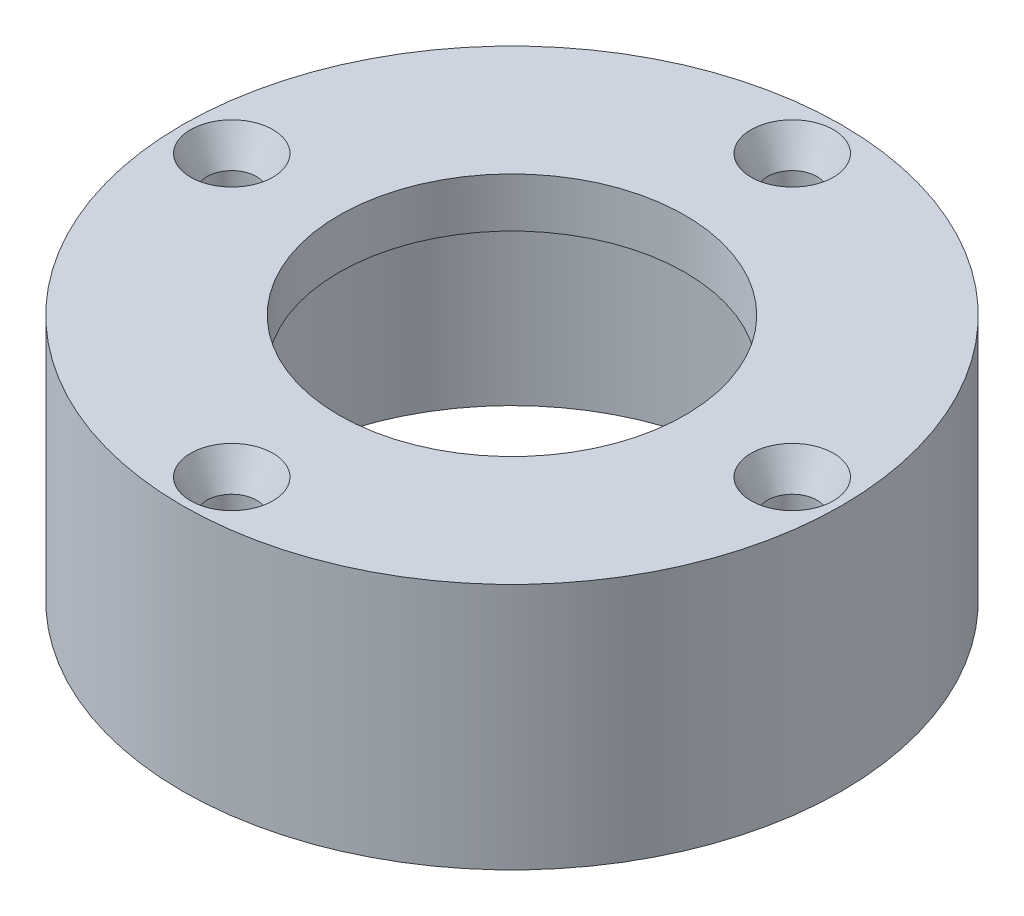
ISO-10303-21;
HEADER;
FILE_DESCRIPTION(('STEP AP214'),'2;1');
FILE_NAME('part.step','',(''),(''),'','','');
FILE_SCHEMA(('AUTOMOTIVE_DESIGN { 1 0 10303 214 1 1 1 1 }'));
ENDSEC;
DATA;
#1=APPLICATION_CONTEXT('core data for automotive mechanical design processes');
#2=APPLICATION_PROTOCOL_DEFINITION('international standard','automotive_design',2000,#1);
#3=PRODUCT_CONTEXT('',#1,'mechanical');
#4=PRODUCT('Part','Part','',(#3));
#5=PRODUCT_RELATED_PRODUCT_CATEGORY('part','',(#4));
#6=PRODUCT_DEFINITION_FORMATION('','',#4);
#7=PRODUCT_DEFINITION_CONTEXT('part definition',#1,'design');
#8=PRODUCT_DEFINITION('design','',#6,#7);
#9=PRODUCT_DEFINITION_SHAPE('','',#8);
#10=(LENGTH_UNIT() NAMED_UNIT(*) SI_UNIT(.MILLI.,.METRE.));
#11=(NAMED_UNIT(*) PLANE_ANGLE_UNIT() SI_UNIT($,.RADIAN.));
#12=(NAMED_UNIT(*) SI_UNIT($,.STERADIAN.) SOLID_ANGLE_UNIT());
#13=UNCERTAINTY_MEASURE_WITH_UNIT(LENGTH_MEASURE(1.E-05),#10,'distance_accuracy_value','');
#14=(GEOMETRIC_REPRESENTATION_CONTEXT(3) GLOBAL_UNCERTAINTY_ASSIGNED_CONTEXT((#13)) GLOBAL_UNIT_ASSIGNED_CONTEXT((#10,
#11,#12)) REPRESENTATION_CONTEXT('',''));
#15=CARTESIAN_POINT('',(0.,0.,0.));
#16=DIRECTION('',(0.,0.,1.));
#17=DIRECTION('',(1.,0.,0.));
#18=AXIS2_PLACEMENT_3D('',#15,#16,#17);
#19=CARTESIAN_POINT('',(0.,15.,0.));
#20=DIRECTION('',(0.,-1.,0.));
#21=DIRECTION('',(0.,0.,-1.));
#22=AXIS2_PLACEMENT_3D('',#19,#20,#21);
#23=CYLINDRICAL_SURFACE('',#22,20.);
#24=CARTESIAN_POINT('',(0.,15.,0.));
#25=DIRECTION('',(0.,1.,0.));
#26=DIRECTION('',(0.,0.,1.));
#27=AXIS2_PLACEMENT_3D('',#24,#25,#26);
#28=CIRCLE('',#27,20.);
#29=CARTESIAN_POINT('',(0.,15.,20.));
#30=VERTEX_POINT('',#29);
#31=EDGE_CURVE('E10',#30,#30,#28,.T.);
#32=ORIENTED_EDGE('',*,*,#31,.F.);
#33=EDGE_LOOP('',(#32));
#34=FACE_BOUND('',#33,.T.);
#35=CARTESIAN_POINT('',(0.,0.,0.));
#36=DIRECTION('',(0.,1.,0.));
#37=DIRECTION('',(0.,0.,1.));
#38=AXIS2_PLACEMENT_3D('',#35,#36,#37);
#39=CIRCLE('',#38,20.);
#40=CARTESIAN_POINT('',(0.,0.,20.));
#41=VERTEX_POINT('',#40);
#42=EDGE_CURVE('E38',#41,#41,#39,.T.);
#43=ORIENTED_EDGE('',*,*,#42,.T.);
#44=EDGE_LOOP('',(#43));
#45=FACE_BOUND('',#44,.T.);
#46=ADVANCED_FACE('F31',(#34,#45),#23,.T.);
#47=CARTESIAN_POINT('',(0.,15.,0.));
#48=DIRECTION('',(0.,1.,0.));
#49=DIRECTION('',(0.,0.,1.));
#50=AXIS2_PLACEMENT_3D('',#47,#48,#49);
#51=PLANE('',#50);
#52=CARTESIAN_POINT('',(-16.9999999999995,15.,4.83169060316868E-13));
#53=DIRECTION('',(0.,1.,0.));
#54=DIRECTION('',(0.,0.,1.));
#55=AXIS2_PLACEMENT_3D('',#52,#53,#54);
#56=CIRCLE('',#55,2.5);
#57=CARTESIAN_POINT('',(-16.9999999999995,15.,2.50000000000048));
#58=VERTEX_POINT('',#57);
#59=EDGE_CURVE('E73',#58,#58,#56,.T.);
#60=ORIENTED_EDGE('',*,*,#59,.F.);
#61=EDGE_LOOP('',(#60));
#62=FACE_BOUND('',#61,.T.);
#63=CARTESIAN_POINT('',(9.62174321516635E-13,15.,17.));
#64=DIRECTION('',(0.,1.,0.));
#65=DIRECTION('',(0.,0.,1.));
#66=AXIS2_PLACEMENT_3D('',#63,#64,#65);
#67=CIRCLE('',#66,2.5);
#68=CARTESIAN_POINT('',(9.62174321516635E-13,15.,19.5));
#69=VERTEX_POINT('',#68);
#70=EDGE_CURVE('E63',#69,#69,#67,.T.);
#71=ORIENTED_EDGE('',*,*,#70,.F.);
#72=EDGE_LOOP('',(#71));
#73=FACE_BOUND('',#72,.T.);
#74=CARTESIAN_POINT('',(17.0000000000005,15.,-4.81087160758318E-13));
#75=DIRECTION('',(0.,1.,0.));
#76=DIRECTION('',(0.,0.,1.));
#77=AXIS2_PLACEMENT_3D('',#74,#75,#76);
#78=CIRCLE('',#77,2.5);
#79=CARTESIAN_POINT('',(17.0000000000005,15.,2.49999999999952));
#80=VERTEX_POINT('',#79);
#81=EDGE_CURVE('E60',#80,#80,#78,.T.);
#82=ORIENTED_EDGE('',*,*,#81,.F.);
#83=EDGE_LOOP('',(#82));
#84=FACE_BOUND('',#83,.T.);
#85=CARTESIAN_POINT('',(0.,15.,-17.));
#86=DIRECTION('',(0.,1.,0.));
#87=DIRECTION('',(0.,0.,1.));
#88=AXIS2_PLACEMENT_3D('',#85,#86,#87);
#89=CIRCLE('',#88,2.5);
#90=CARTESIAN_POINT('',(0.,15.,-14.5));
#91=VERTEX_POINT('',#90);
#92=EDGE_CURVE('E57',#91,#91,#89,.T.);
#93=ORIENTED_EDGE('',*,*,#92,.F.);
#94=EDGE_LOOP('',(#93));
#95=FACE_BOUND('',#94,.T.);
#96=CARTESIAN_POINT('',(0.,15.,0.));
#97=DIRECTION('',(0.,1.,0.));
#98=DIRECTION('',(0.,0.,1.));
#99=AXIS2_PLACEMENT_3D('',#96,#97,#98);
#100=CIRCLE('',#99,10.5);
#101=CARTESIAN_POINT('',(0.,15.,10.5));
#102=VERTEX_POINT('',#101);
#103=EDGE_CURVE('E52',#102,#102,#100,.T.);
#104=ORIENTED_EDGE('',*,*,#103,.F.);
#105=EDGE_LOOP('',(#104));
#106=FACE_BOUND('',#105,.T.);
#107=ORIENTED_EDGE('',*,*,#31,.T.);
#108=EDGE_LOOP('',(#107));
#109=FACE_BOUND('',#108,.T.);
#110=ADVANCED_FACE('F101',(#62,#73,#84,#95,#106,#109),#51,.T.);
#111=CARTESIAN_POINT('',(0.,0.,0.));
#112=DIRECTION('',(0.,1.,0.));
#113=DIRECTION('',(0.,0.,1.));
#114=AXIS2_PLACEMENT_3D('',#111,#112,#113);
#115=PLANE('',#114);
#116=CARTESIAN_POINT('',(-16.9999999999995,0.,4.83169060316868E-13));
#117=DIRECTION('',(0.,1.,0.));
#118=DIRECTION('',(0.,0.,1.));
#119=AXIS2_PLACEMENT_3D('',#116,#117,#118);
#120=CIRCLE('',#119,1.50000000000077);
#121=CARTESIAN_POINT('',(-16.9999999999995,0.,1.50000000000125));
#122=VERTEX_POINT('',#121);
#123=EDGE_CURVE('E56',#122,#122,#120,.T.);
#124=ORIENTED_EDGE('',*,*,#123,.T.);
#125=EDGE_LOOP('',(#124));
#126=FACE_BOUND('',#125,.T.);
#127=CARTESIAN_POINT('',(9.62174321516635E-13,0.,17.));
#128=DIRECTION('',(0.,1.,0.));
#129=DIRECTION('',(0.,0.,1.));
#130=AXIS2_PLACEMENT_3D('',#127,#128,#129);
#131=CIRCLE('',#130,1.50000000000103);
#132=CARTESIAN_POINT('',(9.62174321516635E-13,0.,18.500000000001));
#133=VERTEX_POINT('',#132);
#134=EDGE_CURVE('E80',#133,#133,#131,.T.);
#135=ORIENTED_EDGE('',*,*,#134,.T.);
#136=EDGE_LOOP('',(#135));
#137=FACE_BOUND('',#136,.T.);
#138=CARTESIAN_POINT('',(17.0000000000005,0.,-4.81087160758318E-13));
#139=DIRECTION('',(0.,1.,0.));
#140=DIRECTION('',(0.,0.,1.));
#141=AXIS2_PLACEMENT_3D('',#138,#139,#140);
#142=CIRCLE('',#141,1.50000000000038);
#143=CARTESIAN_POINT('',(17.0000000000005,0.,1.4999999999999));
#144=VERTEX_POINT('',#143);
#145=EDGE_CURVE('E83',#144,#144,#142,.T.);
#146=ORIENTED_EDGE('',*,*,#145,.T.);
#147=EDGE_LOOP('',(#146));
#148=FACE_BOUND('',#147,.T.);
#149=CARTESIAN_POINT('',(0.,0.,-17.));
#150=DIRECTION('',(0.,1.,0.));
#151=DIRECTION('',(0.,0.,1.));
#152=AXIS2_PLACEMENT_3D('',#149,#150,#151);
#153=CIRCLE('',#152,1.5);
#154=CARTESIAN_POINT('',(0.,0.,-15.5));
#155=VERTEX_POINT('',#154);
#156=EDGE_CURVE('E86',#155,#155,#153,.T.);
#157=ORIENTED_EDGE('',*,*,#156,.T.);
#158=EDGE_LOOP('',(#157));
#159=FACE_BOUND('',#158,.T.);
#160=CARTESIAN_POINT('',(0.,0.,0.));
#161=DIRECTION('',(0.,-1.,0.));
#162=DIRECTION('',(0.,0.,-1.));
#163=AXIS2_PLACEMENT_3D('',#160,#161,#162);
#164=CIRCLE('',#163,14.5);
#165=CARTESIAN_POINT('',(0.,0.,-14.5));
#166=VERTEX_POINT('',#165);
#167=EDGE_CURVE('E46',#166,#166,#164,.T.);
#168=ORIENTED_EDGE('',*,*,#167,.F.);
#169=EDGE_LOOP('',(#168));
#170=FACE_BOUND('',#169,.T.);
#171=ORIENTED_EDGE('',*,*,#42,.F.);
#172=EDGE_LOOP('',(#171));
#173=FACE_BOUND('',#172,.T.);
#174=ADVANCED_FACE('F98',(#126,#137,#148,#159,#170,#173),#115,.F.);
#175=CARTESIAN_POINT('',(0.,12.,0.));
#176=DIRECTION('',(0.,-1.,0.));
#177=DIRECTION('',(0.,0.,-1.));
#178=AXIS2_PLACEMENT_3D('',#175,#176,#177);
#179=CYLINDRICAL_SURFACE('',#178,14.5);
#180=CARTESIAN_POINT('',(0.,12.,0.));
#181=DIRECTION('',(0.,-1.,0.));
#182=DIRECTION('',(0.,0.,-1.));
#183=AXIS2_PLACEMENT_3D('',#180,#181,#182);
#184=CIRCLE('',#183,14.5);
#185=CARTESIAN_POINT('',(0.,12.,-14.5));
#186=VERTEX_POINT('',#185);
#187=EDGE_CURVE('E43',#186,#186,#184,.T.);
#188=ORIENTED_EDGE('',*,*,#187,.F.);
#189=EDGE_LOOP('',(#188));
#190=FACE_BOUND('',#189,.T.);
#191=ORIENTED_EDGE('',*,*,#167,.T.);
#192=EDGE_LOOP('',(#191));
#193=FACE_BOUND('',#192,.T.);
#194=ADVANCED_FACE('F96',(#190,#193),#179,.F.);
#195=CARTESIAN_POINT('',(0.,12.,0.));
#196=DIRECTION('',(0.,-1.,0.));
#197=DIRECTION('',(0.,0.,-1.));
#198=AXIS2_PLACEMENT_3D('',#195,#196,#197);
#199=PLANE('',#198);
#200=CARTESIAN_POINT('',(0.,12.,0.));
#201=DIRECTION('',(0.,-1.,0.));
#202=DIRECTION('',(0.,0.,-1.));
#203=AXIS2_PLACEMENT_3D('',#200,#201,#202);
#204=CIRCLE('',#203,10.5);
#205=CARTESIAN_POINT('',(0.,12.,-10.5));
#206=VERTEX_POINT('',#205);
#207=EDGE_CURVE('E49',#206,#206,#204,.T.);
#208=ORIENTED_EDGE('',*,*,#207,.F.);
#209=EDGE_LOOP('',(#208));
#210=FACE_BOUND('',#209,.T.);
#211=ORIENTED_EDGE('',*,*,#187,.T.);
#212=EDGE_LOOP('',(#211));
#213=FACE_BOUND('',#212,.T.);
#214=ADVANCED_FACE('F119',(#210,#213),#199,.T.);
#215=CARTESIAN_POINT('',(0.,3.,0.));
#216=DIRECTION('',(0.,1.,0.));
#217=DIRECTION('',(0.,0.,1.));
#218=AXIS2_PLACEMENT_3D('',#215,#216,#217);
#219=CYLINDRICAL_SURFACE('',#218,10.5);
#220=ORIENTED_EDGE('',*,*,#207,.T.);
#221=EDGE_LOOP('',(#220));
#222=FACE_BOUND('',#221,.T.);
#223=ORIENTED_EDGE('',*,*,#103,.T.);
#224=EDGE_LOOP('',(#223));
#225=FACE_BOUND('',#224,.T.);
#226=ADVANCED_FACE('F123',(#222,#225),#219,.F.);
#227=CARTESIAN_POINT('',(0.,0.,-17.));
#228=DIRECTION('',(0.,1.,0.));
#229=DIRECTION('',(0.,0.,1.));
#230=AXIS2_PLACEMENT_3D('',#227,#228,#229);
#231=CYLINDRICAL_SURFACE('',#230,1.5);
#232=CARTESIAN_POINT('',(0.,13.0373894944949,-17.));
#233=DIRECTION('',(0.,1.,0.));
#234=DIRECTION('',(0.,0.,1.));
#235=AXIS2_PLACEMENT_3D('',#232,#233,#234);
#236=CIRCLE('',#235,1.5);
#237=CARTESIAN_POINT('',(0.,13.0373894944949,-15.5));
#238=VERTEX_POINT('',#237);
#239=EDGE_CURVE('E53',#238,#238,#236,.T.);
#240=ORIENTED_EDGE('',*,*,#239,.T.);
#241=EDGE_LOOP('',(#240));
#242=FACE_BOUND('',#241,.T.);
#243=ORIENTED_EDGE('',*,*,#156,.F.);
#244=EDGE_LOOP('',(#243));
#245=FACE_BOUND('',#244,.T.);
#246=ADVANCED_FACE('F127',(#242,#245),#231,.F.);
#247=CARTESIAN_POINT('',(17.0000000000005,0.,-4.81087160758318E-13));
#248=DIRECTION('',(0.,1.,0.));
#249=DIRECTION('',(0.,0.,1.));
#250=AXIS2_PLACEMENT_3D('',#247,#248,#249);
#251=CYLINDRICAL_SURFACE('',#250,1.50000000000038);
#252=CARTESIAN_POINT('',(17.0000000000005,13.0373894944956,-4.81087160758318E-13));
#253=DIRECTION('',(0.,1.,0.));
#254=DIRECTION('',(0.,0.,1.));
#255=AXIS2_PLACEMENT_3D('',#252,#253,#254);
#256=CIRCLE('',#255,1.50000000000038);
#257=CARTESIAN_POINT('',(17.0000000000005,13.0373894944956,1.4999999999999));
#258=VERTEX_POINT('',#257);
#259=EDGE_CURVE('E58',#258,#258,#256,.T.);
#260=ORIENTED_EDGE('',*,*,#259,.T.);
#261=EDGE_LOOP('',(#260));
#262=FACE_BOUND('',#261,.T.);
#263=ORIENTED_EDGE('',*,*,#145,.F.);
#264=EDGE_LOOP('',(#263));
#265=FACE_BOUND('',#264,.T.);
#266=ADVANCED_FACE('F131',(#262,#265),#251,.F.);
#267=CARTESIAN_POINT('',(9.62174321516635E-13,0.,17.));
#268=DIRECTION('',(0.,1.,0.));
#269=DIRECTION('',(0.,0.,1.));
#270=AXIS2_PLACEMENT_3D('',#267,#268,#269);
#271=CYLINDRICAL_SURFACE('',#270,1.50000000000103);
#272=CARTESIAN_POINT('',(9.62174321516635E-13,13.0373894944969,17.));
#273=DIRECTION('',(0.,1.,0.));
#274=DIRECTION('',(0.,0.,1.));
#275=AXIS2_PLACEMENT_3D('',#272,#273,#274);
#276=CIRCLE('',#275,1.50000000000103);
#277=CARTESIAN_POINT('',(9.62174321516635E-13,13.0373894944969,18.500000000001));
#278=VERTEX_POINT('',#277);
#279=EDGE_CURVE('E61',#278,#278,#276,.T.);
#280=ORIENTED_EDGE('',*,*,#279,.T.);
#281=EDGE_LOOP('',(#280));
#282=FACE_BOUND('',#281,.T.);
#283=ORIENTED_EDGE('',*,*,#134,.F.);
#284=EDGE_LOOP('',(#283));
#285=FACE_BOUND('',#284,.T.);
#286=ADVANCED_FACE('F135',(#282,#285),#271,.F.);
#287=CARTESIAN_POINT('',(-16.9999999999995,0.,4.83169060316868E-13));
#288=DIRECTION('',(0.,1.,0.));
#289=DIRECTION('',(0.,0.,1.));
#290=AXIS2_PLACEMENT_3D('',#287,#288,#289);
#291=CYLINDRICAL_SURFACE('',#290,1.50000000000077);
#292=CARTESIAN_POINT('',(-16.9999999999995,13.0373894944964,4.83169060316868E-13));
#293=DIRECTION('',(0.,1.,0.));
#294=DIRECTION('',(0.,0.,1.));
#295=AXIS2_PLACEMENT_3D('',#292,#293,#294);
#296=CIRCLE('',#295,1.50000000000077);
#297=CARTESIAN_POINT('',(-16.9999999999995,13.0373894944964,1.50000000000125));
#298=VERTEX_POINT('',#297);
#299=EDGE_CURVE('E34',#298,#298,#296,.T.);
#300=ORIENTED_EDGE('',*,*,#299,.T.);
#301=EDGE_LOOP('',(#300));
#302=FACE_BOUND('',#301,.T.);
#303=ORIENTED_EDGE('',*,*,#123,.F.);
#304=EDGE_LOOP('',(#303));
#305=FACE_BOUND('',#304,.T.);
#306=ADVANCED_FACE('F139',(#302,#305),#291,.F.);
#307=CARTESIAN_POINT('',(0.,15.,-17.));
#308=DIRECTION('',(0.,1.,0.));
#309=DIRECTION('',(0.,0.,1.));
#310=AXIS2_PLACEMENT_3D('',#307,#308,#309);
#311=CONICAL_SURFACE('',#310,2.5,0.471238898038469);
#312=ORIENTED_EDGE('',*,*,#92,.T.);
#313=EDGE_LOOP('',(#312));
#314=FACE_BOUND('',#313,.T.);
#315=ORIENTED_EDGE('',*,*,#239,.F.);
#316=EDGE_LOOP('',(#315));
#317=FACE_BOUND('',#316,.T.);
#318=ADVANCED_FACE('F142',(#314,#317),#311,.F.);
#319=CARTESIAN_POINT('',(17.0000000000005,15.,-4.81087160758318E-13));
#320=DIRECTION('',(0.,1.,0.));
#321=DIRECTION('',(0.,0.,1.));
#322=AXIS2_PLACEMENT_3D('',#319,#320,#321);
#323=CONICAL_SURFACE('',#322,2.5,0.471238898038469);
#324=ORIENTED_EDGE('',*,*,#81,.T.);
#325=EDGE_LOOP('',(#324));
#326=FACE_BOUND('',#325,.T.);
#327=ORIENTED_EDGE('',*,*,#259,.F.);
#328=EDGE_LOOP('',(#327));
#329=FACE_BOUND('',#328,.T.);
#330=ADVANCED_FACE('F146',(#326,#329),#323,.F.);
#331=CARTESIAN_POINT('',(9.62174321516635E-13,15.,17.));
#332=DIRECTION('',(0.,1.,0.));
#333=DIRECTION('',(0.,0.,1.));
#334=AXIS2_PLACEMENT_3D('',#331,#332,#333);
#335=CONICAL_SURFACE('',#334,2.5,0.471238898038469);
#336=ORIENTED_EDGE('',*,*,#70,.T.);
#337=EDGE_LOOP('',(#336));
#338=FACE_BOUND('',#337,.T.);
#339=ORIENTED_EDGE('',*,*,#279,.F.);
#340=EDGE_LOOP('',(#339));
#341=FACE_BOUND('',#340,.T.);
#342=ADVANCED_FACE('F150',(#338,#341),#335,.F.);
#343=CARTESIAN_POINT('',(-16.9999999999995,15.,4.83169060316868E-13));
#344=DIRECTION('',(0.,1.,0.));
#345=DIRECTION('',(0.,0.,1.));
#346=AXIS2_PLACEMENT_3D('',#343,#344,#345);
#347=CONICAL_SURFACE('',#346,2.5,0.471238898038469);
#348=ORIENTED_EDGE('',*,*,#59,.T.);
#349=EDGE_LOOP('',(#348));
#350=FACE_BOUND('',#349,.T.);
#351=ORIENTED_EDGE('',*,*,#299,.F.);
#352=EDGE_LOOP('',(#351));
#353=FACE_BOUND('',#352,.T.);
#354=ADVANCED_FACE('F154',(#350,#353),#347,.F.);
#355=CLOSED_SHELL('',(#46,#110,#174,#194,#214,#226,#246,#266,#286,#306,#318,#330,#342,#354));
#356=MANIFOLD_SOLID_BREP('B2',#355);
#357=ADVANCED_BREP_SHAPE_REPRESENTATION('',(#18,#356),#14);
#358=SHAPE_DEFINITION_REPRESENTATION(#9,#357);
ENDSEC;
END-ISO-10303-21;
